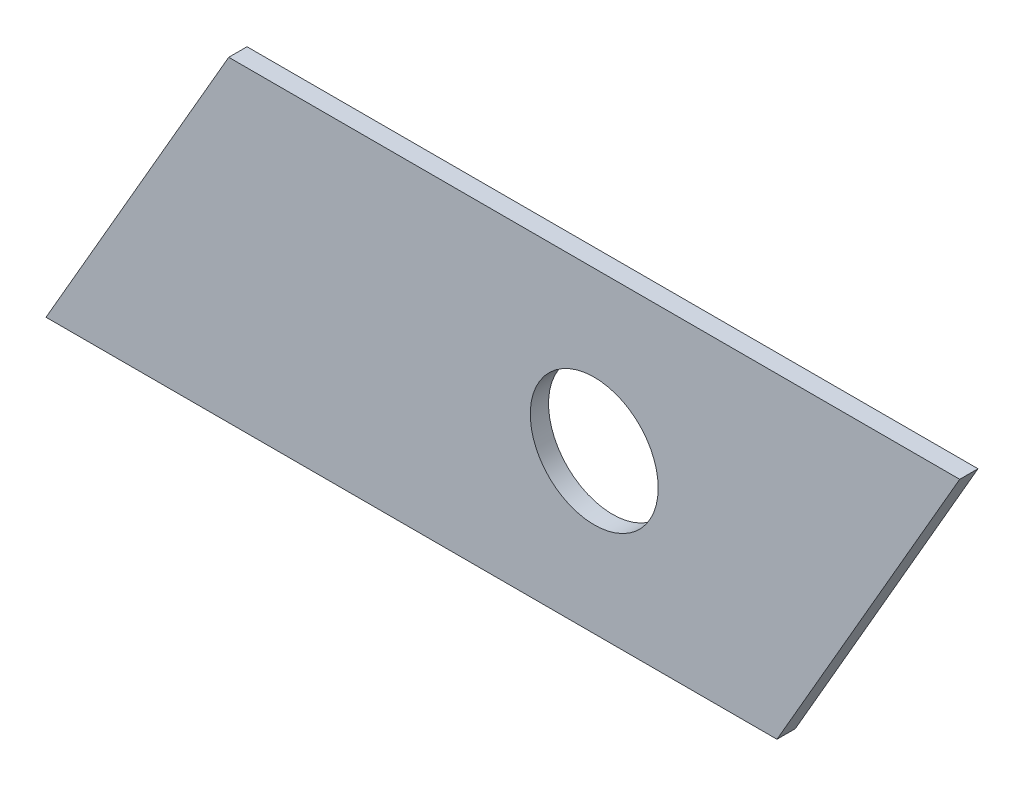
ISO-10303-21;
HEADER;
FILE_DESCRIPTION(('STEP AP214'),'2;1');
FILE_NAME('part.step','',(''),(''),'','','');
FILE_SCHEMA(('AUTOMOTIVE_DESIGN { 1 0 10303 214 1 1 1 1 }'));
ENDSEC;
DATA;
#1=APPLICATION_CONTEXT('core data for automotive mechanical design processes');
#2=APPLICATION_PROTOCOL_DEFINITION('international standard','automotive_design',2000,#1);
#3=PRODUCT_CONTEXT('',#1,'mechanical');
#4=PRODUCT('Part','Part','',(#3));
#5=PRODUCT_RELATED_PRODUCT_CATEGORY('part','',(#4));
#6=PRODUCT_DEFINITION_FORMATION('','',#4);
#7=PRODUCT_DEFINITION_CONTEXT('part definition',#1,'design');
#8=PRODUCT_DEFINITION('design','',#6,#7);
#9=PRODUCT_DEFINITION_SHAPE('','',#8);
#10=(LENGTH_UNIT() NAMED_UNIT(*) SI_UNIT(.MILLI.,.METRE.));
#11=(NAMED_UNIT(*) PLANE_ANGLE_UNIT() SI_UNIT($,.RADIAN.));
#12=(NAMED_UNIT(*) SI_UNIT($,.STERADIAN.) SOLID_ANGLE_UNIT());
#13=UNCERTAINTY_MEASURE_WITH_UNIT(LENGTH_MEASURE(1.E-05),#10,'distance_accuracy_value','');
#14=(GEOMETRIC_REPRESENTATION_CONTEXT(3) GLOBAL_UNCERTAINTY_ASSIGNED_CONTEXT((#13)) GLOBAL_UNIT_ASSIGNED_CONTEXT((#10,
#11,#12)) REPRESENTATION_CONTEXT('',''));
#15=CARTESIAN_POINT('',(0.,0.,0.));
#16=DIRECTION('',(0.,0.,1.));
#17=DIRECTION('',(1.,0.,0.));
#18=AXIS2_PLACEMENT_3D('',#15,#16,#17);
#19=CARTESIAN_POINT('',(-14.9999999999999,8.66025403784444,0.5));
#20=DIRECTION('',(0.866025403784436,-0.500000000000004,0.));
#21=DIRECTION('',(0.500000000000004,0.866025403784436,0.));
#22=AXIS2_PLACEMENT_3D('',#19,#20,#21);
#23=PLANE('',#22);
#24=DIRECTION('',(-0.500000000000004,-0.866025403784436,0.));
#25=VECTOR('',#24,1.);
#26=CARTESIAN_POINT('',(-14.9999999999999,8.66025403784444,0.));
#27=LINE('',#26,#25);
#28=CARTESIAN_POINT('',(-15.,8.66025403784425,0.));
#29=VERTEX_POINT('',#28);
#30=CARTESIAN_POINT('',(-20.,0.,0.));
#31=VERTEX_POINT('',#30);
#32=EDGE_CURVE('E112',#29,#31,#27,.T.);
#33=ORIENTED_EDGE('',*,*,#32,.T.);
#34=DIRECTION('',(0.,0.,-1.));
#35=VECTOR('',#34,1.);
#36=CARTESIAN_POINT('',(-20.,0.,0.5));
#37=LINE('',#36,#35);
#38=CARTESIAN_POINT('',(-20.,0.,0.5));
#39=VERTEX_POINT('',#38);
#40=EDGE_CURVE('E11',#39,#31,#37,.T.);
#41=ORIENTED_EDGE('',*,*,#40,.F.);
#42=DIRECTION('',(-0.500000000000004,-0.866025403784436,0.));
#43=VECTOR('',#42,1.);
#44=CARTESIAN_POINT('',(-14.9999999999999,8.66025403784444,0.5));
#45=LINE('',#44,#43);
#46=CARTESIAN_POINT('',(-15.,8.66025403784425,0.5));
#47=VERTEX_POINT('',#46);
#48=EDGE_CURVE('E92',#47,#39,#45,.T.);
#49=ORIENTED_EDGE('',*,*,#48,.F.);
#50=DIRECTION('',(0.,0.,-1.));
#51=VECTOR('',#50,1.);
#52=CARTESIAN_POINT('',(-15.,8.66025403784425,0.5));
#53=LINE('',#52,#51);
#54=EDGE_CURVE('E104',#47,#29,#53,.T.);
#55=ORIENTED_EDGE('',*,*,#54,.T.);
#56=EDGE_LOOP('',(#33,#41,#49,#55));
#57=FACE_BOUND('',#56,.T.);
#58=ADVANCED_FACE('F39',(#57),#23,.F.);
#59=CARTESIAN_POINT('',(0.,0.,0.5));
#60=DIRECTION('',(0.,1.,0.));
#61=DIRECTION('',(0.,0.,1.));
#62=AXIS2_PLACEMENT_3D('',#59,#60,#61);
#63=PLANE('',#62);
#64=DIRECTION('',(1.,0.,0.));
#65=VECTOR('',#64,1.);
#66=CARTESIAN_POINT('',(0.,0.,0.));
#67=LINE('',#66,#65);
#68=CARTESIAN_POINT('',(0.,0.,0.));
#69=VERTEX_POINT('',#68);
#70=EDGE_CURVE('E97',#31,#69,#67,.T.);
#71=ORIENTED_EDGE('',*,*,#70,.T.);
#72=DIRECTION('',(0.,0.,-1.));
#73=VECTOR('',#72,1.);
#74=CARTESIAN_POINT('',(0.,0.,0.5));
#75=LINE('',#74,#73);
#76=CARTESIAN_POINT('',(0.,0.,0.5));
#77=VERTEX_POINT('',#76);
#78=EDGE_CURVE('E49',#77,#69,#75,.T.);
#79=ORIENTED_EDGE('',*,*,#78,.F.);
#80=DIRECTION('',(1.,0.,0.));
#81=VECTOR('',#80,1.);
#82=CARTESIAN_POINT('',(0.,0.,0.5));
#83=LINE('',#82,#81);
#84=EDGE_CURVE('E87',#39,#77,#83,.T.);
#85=ORIENTED_EDGE('',*,*,#84,.F.);
#86=ORIENTED_EDGE('',*,*,#40,.T.);
#87=EDGE_LOOP('',(#71,#79,#85,#86));
#88=FACE_BOUND('',#87,.T.);
#89=ADVANCED_FACE('F96',(#88),#63,.F.);
#90=CARTESIAN_POINT('',(0.,0.,0.5));
#91=DIRECTION('',(-0.86602540378444,0.499999999999998,0.));
#92=DIRECTION('',(-0.499999999999998,-0.86602540378444,0.));
#93=AXIS2_PLACEMENT_3D('',#90,#91,#92);
#94=PLANE('',#93);
#95=DIRECTION('',(0.499999999999998,0.86602540378444,0.));
#96=VECTOR('',#95,1.);
#97=CARTESIAN_POINT('',(0.,0.,0.));
#98=LINE('',#97,#96);
#99=CARTESIAN_POINT('',(4.99999999999998,8.6602540378444,0.));
#100=VERTEX_POINT('',#99);
#101=EDGE_CURVE('E74',#69,#100,#98,.T.);
#102=ORIENTED_EDGE('',*,*,#101,.T.);
#103=DIRECTION('',(0.,0.,-1.));
#104=VECTOR('',#103,1.);
#105=CARTESIAN_POINT('',(4.99999999999998,8.6602540378444,0.5));
#106=LINE('',#105,#104);
#107=CARTESIAN_POINT('',(4.99999999999998,8.6602540378444,0.5));
#108=VERTEX_POINT('',#107);
#109=EDGE_CURVE('E99',#108,#100,#106,.T.);
#110=ORIENTED_EDGE('',*,*,#109,.F.);
#111=DIRECTION('',(0.499999999999998,0.86602540378444,0.));
#112=VECTOR('',#111,1.);
#113=CARTESIAN_POINT('',(0.,0.,0.5));
#114=LINE('',#113,#112);
#115=EDGE_CURVE('E90',#77,#108,#114,.T.);
#116=ORIENTED_EDGE('',*,*,#115,.F.);
#117=ORIENTED_EDGE('',*,*,#78,.T.);
#118=EDGE_LOOP('',(#102,#110,#116,#117));
#119=FACE_BOUND('',#118,.T.);
#120=ADVANCED_FACE('F100',(#119),#94,.F.);
#121=CARTESIAN_POINT('',(-5.,4.33012701892213,0.5));
#122=DIRECTION('',(0.,0.,-1.));
#123=DIRECTION('',(-1.,0.,0.));
#124=AXIS2_PLACEMENT_3D('',#121,#122,#123);
#125=CYLINDRICAL_SURFACE('',#124,1.75);
#126=CARTESIAN_POINT('',(-5.,4.33012701892213,0.5));
#127=DIRECTION('',(0.,0.,1.));
#128=DIRECTION('',(1.,0.,0.));
#129=AXIS2_PLACEMENT_3D('',#126,#127,#128);
#130=CIRCLE('',#129,1.75);
#131=CARTESIAN_POINT('',(-3.25,4.33012701892213,0.5));
#132=VERTEX_POINT('',#131);
#133=EDGE_CURVE('E122',#132,#132,#130,.T.);
#134=ORIENTED_EDGE('',*,*,#133,.T.);
#135=EDGE_LOOP('',(#134));
#136=FACE_BOUND('',#135,.T.);
#137=CARTESIAN_POINT('',(-5.,4.33012701892213,0.));
#138=DIRECTION('',(0.,0.,1.));
#139=DIRECTION('',(1.,0.,0.));
#140=AXIS2_PLACEMENT_3D('',#137,#138,#139);
#141=CIRCLE('',#140,1.75);
#142=CARTESIAN_POINT('',(-3.25,4.33012701892213,0.));
#143=VERTEX_POINT('',#142);
#144=EDGE_CURVE('E108',#143,#143,#141,.T.);
#145=ORIENTED_EDGE('',*,*,#144,.F.);
#146=EDGE_LOOP('',(#145));
#147=FACE_BOUND('',#146,.T.);
#148=ADVANCED_FACE('F41',(#136,#147),#125,.F.);
#149=CARTESIAN_POINT('',(0.,8.66025403784436,0.5));
#150=DIRECTION('',(0.,-1.,0.));
#151=DIRECTION('',(1.,0.,0.));
#152=AXIS2_PLACEMENT_3D('',#149,#150,#151);
#153=PLANE('',#152);
#154=DIRECTION('',(-1.,0.,0.));
#155=VECTOR('',#154,1.);
#156=CARTESIAN_POINT('',(0.,8.66025403784436,0.));
#157=LINE('',#156,#155);
#158=EDGE_CURVE('E80',#100,#29,#157,.T.);
#159=ORIENTED_EDGE('',*,*,#158,.T.);
#160=ORIENTED_EDGE('',*,*,#54,.F.);
#161=DIRECTION('',(-1.,0.,0.));
#162=VECTOR('',#161,1.);
#163=CARTESIAN_POINT('',(0.,8.66025403784436,0.5));
#164=LINE('',#163,#162);
#165=EDGE_CURVE('E57',#108,#47,#164,.T.);
#166=ORIENTED_EDGE('',*,*,#165,.F.);
#167=ORIENTED_EDGE('',*,*,#109,.T.);
#168=EDGE_LOOP('',(#159,#160,#166,#167));
#169=FACE_BOUND('',#168,.T.);
#170=ADVANCED_FACE('F126',(#169),#153,.F.);
#171=CARTESIAN_POINT('',(0.,0.,0.5));
#172=DIRECTION('',(0.,0.,1.));
#173=DIRECTION('',(1.,0.,0.));
#174=AXIS2_PLACEMENT_3D('',#171,#172,#173);
#175=PLANE('',#174);
#176=ORIENTED_EDGE('',*,*,#133,.F.);
#177=EDGE_LOOP('',(#176));
#178=FACE_BOUND('',#177,.T.);
#179=ORIENTED_EDGE('',*,*,#48,.T.);
#180=ORIENTED_EDGE('',*,*,#84,.T.);
#181=ORIENTED_EDGE('',*,*,#115,.T.);
#182=ORIENTED_EDGE('',*,*,#165,.T.);
#183=EDGE_LOOP('',(#179,#180,#181,#182));
#184=FACE_BOUND('',#183,.T.);
#185=ADVANCED_FACE('F88',(#178,#184),#175,.T.);
#186=CARTESIAN_POINT('',(0.,0.,0.));
#187=DIRECTION('',(0.,0.,1.));
#188=DIRECTION('',(1.,0.,0.));
#189=AXIS2_PLACEMENT_3D('',#186,#187,#188);
#190=PLANE('',#189);
#191=ORIENTED_EDGE('',*,*,#144,.T.);
#192=EDGE_LOOP('',(#191));
#193=FACE_BOUND('',#192,.T.);
#194=ORIENTED_EDGE('',*,*,#32,.F.);
#195=ORIENTED_EDGE('',*,*,#158,.F.);
#196=ORIENTED_EDGE('',*,*,#101,.F.);
#197=ORIENTED_EDGE('',*,*,#70,.F.);
#198=EDGE_LOOP('',(#194,#195,#196,#197));
#199=FACE_BOUND('',#198,.T.);
#200=ADVANCED_FACE('F129',(#193,#199),#190,.F.);
#201=CLOSED_SHELL('',(#58,#89,#120,#148,#170,#185,#200));
#202=MANIFOLD_SOLID_BREP('B2',#201);
#203=ADVANCED_BREP_SHAPE_REPRESENTATION('',(#18,#202),#14);
#204=SHAPE_DEFINITION_REPRESENTATION(#9,#203);
ENDSEC;
END-ISO-10303-21;
